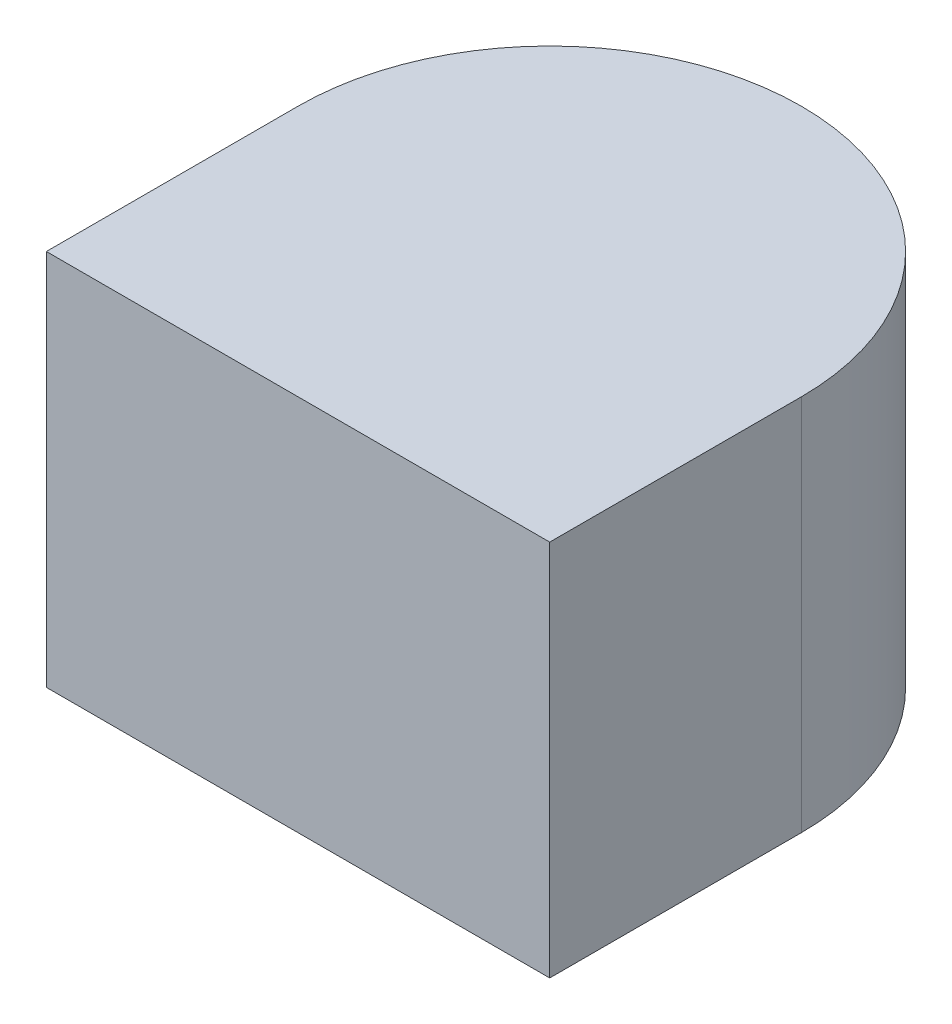
ISO-10303-21;
HEADER;
FILE_DESCRIPTION(('STEP AP214'),'2;1');
FILE_NAME('part.step','',(''),(''),'','','');
FILE_SCHEMA(('AUTOMOTIVE_DESIGN { 1 0 10303 214 1 1 1 1 }'));
ENDSEC;
DATA;
#1=APPLICATION_CONTEXT('core data for automotive mechanical design processes');
#2=APPLICATION_PROTOCOL_DEFINITION('international standard','automotive_design',2000,#1);
#3=PRODUCT_CONTEXT('',#1,'mechanical');
#4=PRODUCT('Part','Part','',(#3));
#5=PRODUCT_RELATED_PRODUCT_CATEGORY('part','',(#4));
#6=PRODUCT_DEFINITION_FORMATION('','',#4);
#7=PRODUCT_DEFINITION_CONTEXT('part definition',#1,'design');
#8=PRODUCT_DEFINITION('design','',#6,#7);
#9=PRODUCT_DEFINITION_SHAPE('','',#8);
#10=(LENGTH_UNIT() NAMED_UNIT(*) SI_UNIT(.MILLI.,.METRE.));
#11=(NAMED_UNIT(*) PLANE_ANGLE_UNIT() SI_UNIT($,.RADIAN.));
#12=(NAMED_UNIT(*) SI_UNIT($,.STERADIAN.) SOLID_ANGLE_UNIT());
#13=UNCERTAINTY_MEASURE_WITH_UNIT(LENGTH_MEASURE(1.E-05),#10,'distance_accuracy_value','');
#14=(GEOMETRIC_REPRESENTATION_CONTEXT(3) GLOBAL_UNCERTAINTY_ASSIGNED_CONTEXT((#13)) GLOBAL_UNIT_ASSIGNED_CONTEXT((#10,
#11,#12)) REPRESENTATION_CONTEXT('',''));
#15=CARTESIAN_POINT('',(0.,0.,0.));
#16=DIRECTION('',(0.,0.,1.));
#17=DIRECTION('',(1.,0.,0.));
#18=AXIS2_PLACEMENT_3D('',#15,#16,#17);
#19=CARTESIAN_POINT('',(0.,15.,10.));
#20=DIRECTION('',(0.,-1.,0.));
#21=DIRECTION('',(0.,0.,-1.));
#22=AXIS2_PLACEMENT_3D('',#19,#20,#21);
#23=CYLINDRICAL_SURFACE('',#22,10.);
#24=CARTESIAN_POINT('',(0.,0.,10.));
#25=DIRECTION('',(0.,1.,0.));
#26=DIRECTION('',(0.,0.,1.));
#27=AXIS2_PLACEMENT_3D('',#24,#25,#26);
#28=CIRCLE('',#27,10.);
#29=CARTESIAN_POINT('',(-10.,0.,10.));
#30=VERTEX_POINT('',#29);
#31=CARTESIAN_POINT('',(10.,0.,10.));
#32=VERTEX_POINT('',#31);
#33=EDGE_CURVE('E108',#30,#32,#28,.F.);
#34=ORIENTED_EDGE('',*,*,#33,.F.);
#35=DIRECTION('',(0.,-1.,0.));
#36=VECTOR('',#35,1.);
#37=CARTESIAN_POINT('',(-10.,15.,10.));
#38=LINE('',#37,#36);
#39=CARTESIAN_POINT('',(-10.,15.,10.));
#40=VERTEX_POINT('',#39);
#41=EDGE_CURVE('E11',#40,#30,#38,.T.);
#42=ORIENTED_EDGE('',*,*,#41,.F.);
#43=CARTESIAN_POINT('',(0.,15.,10.));
#44=DIRECTION('',(0.,1.,0.));
#45=DIRECTION('',(0.,0.,1.));
#46=AXIS2_PLACEMENT_3D('',#43,#44,#45);
#47=CIRCLE('',#46,10.);
#48=CARTESIAN_POINT('',(10.,15.,10.));
#49=VERTEX_POINT('',#48);
#50=EDGE_CURVE('E99',#40,#49,#47,.F.);
#51=ORIENTED_EDGE('',*,*,#50,.T.);
#52=DIRECTION('',(0.,-1.,0.));
#53=VECTOR('',#52,1.);
#54=CARTESIAN_POINT('',(10.,15.,10.));
#55=LINE('',#54,#53);
#56=EDGE_CURVE('E78',#49,#32,#55,.T.);
#57=ORIENTED_EDGE('',*,*,#56,.T.);
#58=EDGE_LOOP('',(#34,#42,#51,#57));
#59=FACE_BOUND('',#58,.T.);
#60=ADVANCED_FACE('F39',(#59),#23,.T.);
#61=CARTESIAN_POINT('',(-9.99999999999999,15.,0.));
#62=DIRECTION('',(-1.,0.,0.));
#63=DIRECTION('',(0.,0.,1.));
#64=AXIS2_PLACEMENT_3D('',#61,#62,#63);
#65=PLANE('',#64);
#66=DIRECTION('',(0.,0.,-1.));
#67=VECTOR('',#66,1.);
#68=CARTESIAN_POINT('',(-9.99999999999999,0.,0.));
#69=LINE('',#68,#67);
#70=CARTESIAN_POINT('',(-10.,0.,20.));
#71=VERTEX_POINT('',#70);
#72=EDGE_CURVE('E91',#71,#30,#69,.T.);
#73=ORIENTED_EDGE('',*,*,#72,.F.);
#74=DIRECTION('',(0.,-1.,0.));
#75=VECTOR('',#74,1.);
#76=CARTESIAN_POINT('',(-10.,15.,20.));
#77=LINE('',#76,#75);
#78=CARTESIAN_POINT('',(-10.,15.,20.));
#79=VERTEX_POINT('',#78);
#80=EDGE_CURVE('E48',#79,#71,#77,.T.);
#81=ORIENTED_EDGE('',*,*,#80,.F.);
#82=DIRECTION('',(0.,0.,-1.));
#83=VECTOR('',#82,1.);
#84=CARTESIAN_POINT('',(-9.99999999999999,15.,0.));
#85=LINE('',#84,#83);
#86=EDGE_CURVE('E89',#79,#40,#85,.T.);
#87=ORIENTED_EDGE('',*,*,#86,.T.);
#88=ORIENTED_EDGE('',*,*,#41,.T.);
#89=EDGE_LOOP('',(#73,#81,#87,#88));
#90=FACE_BOUND('',#89,.T.);
#91=ADVANCED_FACE('F87',(#90),#65,.T.);
#92=CARTESIAN_POINT('',(0.,15.,20.));
#93=DIRECTION('',(0.,0.,-1.));
#94=DIRECTION('',(-1.,0.,0.));
#95=AXIS2_PLACEMENT_3D('',#92,#93,#94);
#96=PLANE('',#95);
#97=DIRECTION('',(1.,0.,0.));
#98=VECTOR('',#97,1.);
#99=CARTESIAN_POINT('',(0.,0.,20.));
#100=LINE('',#99,#98);
#101=CARTESIAN_POINT('',(10.,0.,20.));
#102=VERTEX_POINT('',#101);
#103=EDGE_CURVE('E71',#71,#102,#100,.T.);
#104=ORIENTED_EDGE('',*,*,#103,.T.);
#105=DIRECTION('',(0.,-1.,0.));
#106=VECTOR('',#105,1.);
#107=CARTESIAN_POINT('',(10.,15.,20.));
#108=LINE('',#107,#106);
#109=CARTESIAN_POINT('',(10.,15.,20.));
#110=VERTEX_POINT('',#109);
#111=EDGE_CURVE('E93',#110,#102,#108,.T.);
#112=ORIENTED_EDGE('',*,*,#111,.F.);
#113=DIRECTION('',(1.,0.,0.));
#114=VECTOR('',#113,1.);
#115=CARTESIAN_POINT('',(0.,15.,20.));
#116=LINE('',#115,#114);
#117=EDGE_CURVE('E94',#79,#110,#116,.T.);
#118=ORIENTED_EDGE('',*,*,#117,.F.);
#119=ORIENTED_EDGE('',*,*,#80,.T.);
#120=EDGE_LOOP('',(#104,#112,#118,#119));
#121=FACE_BOUND('',#120,.T.);
#122=ADVANCED_FACE('F95',(#121),#96,.F.);
#123=CARTESIAN_POINT('',(10.,15.,0.));
#124=DIRECTION('',(-1.,0.,0.));
#125=DIRECTION('',(0.,0.,1.));
#126=AXIS2_PLACEMENT_3D('',#123,#124,#125);
#127=PLANE('',#126);
#128=DIRECTION('',(0.,0.,-1.));
#129=VECTOR('',#128,1.);
#130=CARTESIAN_POINT('',(10.,0.,0.));
#131=LINE('',#130,#129);
#132=EDGE_CURVE('E103',#102,#32,#131,.T.);
#133=ORIENTED_EDGE('',*,*,#132,.T.);
#134=ORIENTED_EDGE('',*,*,#56,.F.);
#135=DIRECTION('',(0.,0.,-1.));
#136=VECTOR('',#135,1.);
#137=CARTESIAN_POINT('',(10.,15.,0.));
#138=LINE('',#137,#136);
#139=EDGE_CURVE('E56',#110,#49,#138,.T.);
#140=ORIENTED_EDGE('',*,*,#139,.F.);
#141=ORIENTED_EDGE('',*,*,#111,.T.);
#142=EDGE_LOOP('',(#133,#134,#140,#141));
#143=FACE_BOUND('',#142,.T.);
#144=ADVANCED_FACE('F123',(#143),#127,.F.);
#145=CARTESIAN_POINT('',(0.,15.,0.));
#146=DIRECTION('',(0.,1.,0.));
#147=DIRECTION('',(0.,0.,1.));
#148=AXIS2_PLACEMENT_3D('',#145,#146,#147);
#149=PLANE('',#148);
#150=ORIENTED_EDGE('',*,*,#50,.F.);
#151=ORIENTED_EDGE('',*,*,#86,.F.);
#152=ORIENTED_EDGE('',*,*,#117,.T.);
#153=ORIENTED_EDGE('',*,*,#139,.T.);
#154=EDGE_LOOP('',(#150,#151,#152,#153));
#155=FACE_BOUND('',#154,.T.);
#156=ADVANCED_FACE('F98',(#155),#149,.T.);
#157=CARTESIAN_POINT('',(0.,0.,0.));
#158=DIRECTION('',(0.,1.,0.));
#159=DIRECTION('',(0.,0.,1.));
#160=AXIS2_PLACEMENT_3D('',#157,#158,#159);
#161=PLANE('',#160);
#162=ORIENTED_EDGE('',*,*,#33,.T.);
#163=ORIENTED_EDGE('',*,*,#132,.F.);
#164=ORIENTED_EDGE('',*,*,#103,.F.);
#165=ORIENTED_EDGE('',*,*,#72,.T.);
#166=EDGE_LOOP('',(#162,#163,#164,#165));
#167=FACE_BOUND('',#166,.T.);
#168=ADVANCED_FACE('F125',(#167),#161,.F.);
#169=CLOSED_SHELL('',(#60,#91,#122,#144,#156,#168));
#170=MANIFOLD_SOLID_BREP('B2',#169);
#171=ADVANCED_BREP_SHAPE_REPRESENTATION('',(#18,#170),#14);
#172=SHAPE_DEFINITION_REPRESENTATION(#9,#171);
ENDSEC;
END-ISO-10303-21;
